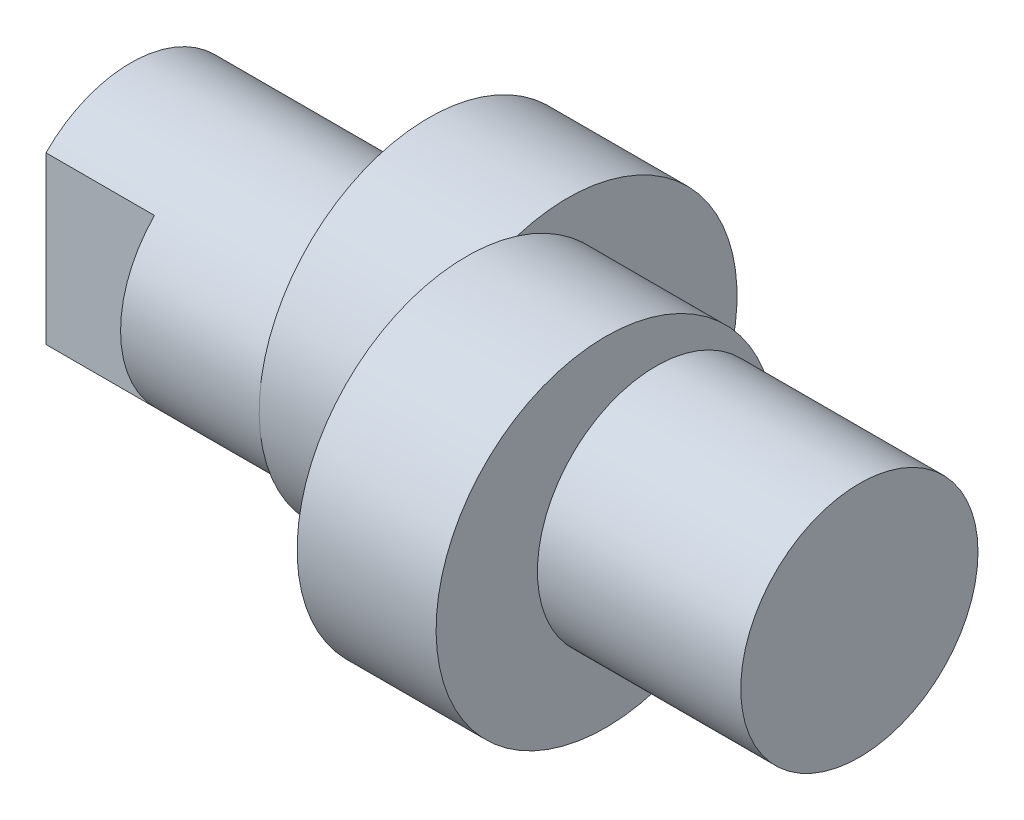
ISO-10303-21;
HEADER;
FILE_DESCRIPTION(('STEP AP214'),'2;1');
FILE_NAME('part.step','',(''),(''),'','','');
FILE_SCHEMA(('AUTOMOTIVE_DESIGN { 1 0 10303 214 1 1 1 1 }'));
ENDSEC;
DATA;
#1=APPLICATION_CONTEXT('core data for automotive mechanical design processes');
#2=APPLICATION_PROTOCOL_DEFINITION('international standard','automotive_design',2000,#1);
#3=PRODUCT_CONTEXT('',#1,'mechanical');
#4=PRODUCT('Part','Part','',(#3));
#5=PRODUCT_RELATED_PRODUCT_CATEGORY('part','',(#4));
#6=PRODUCT_DEFINITION_FORMATION('','',#4);
#7=PRODUCT_DEFINITION_CONTEXT('part definition',#1,'design');
#8=PRODUCT_DEFINITION('design','',#6,#7);
#9=PRODUCT_DEFINITION_SHAPE('','',#8);
#10=(LENGTH_UNIT() NAMED_UNIT(*) SI_UNIT(.MILLI.,.METRE.));
#11=(NAMED_UNIT(*) PLANE_ANGLE_UNIT() SI_UNIT($,.RADIAN.));
#12=(NAMED_UNIT(*) SI_UNIT($,.STERADIAN.) SOLID_ANGLE_UNIT());
#13=UNCERTAINTY_MEASURE_WITH_UNIT(LENGTH_MEASURE(1.E-05),#10,'distance_accuracy_value','');
#14=(GEOMETRIC_REPRESENTATION_CONTEXT(3) GLOBAL_UNCERTAINTY_ASSIGNED_CONTEXT((#13)) GLOBAL_UNIT_ASSIGNED_CONTEXT((#10,
#11,#12)) REPRESENTATION_CONTEXT('',''));
#15=CARTESIAN_POINT('',(0.,0.,0.));
#16=DIRECTION('',(0.,0.,1.));
#17=DIRECTION('',(1.,0.,0.));
#18=AXIS2_PLACEMENT_3D('',#15,#16,#17);
#19=CARTESIAN_POINT('',(-7.3,0.,0.));
#20=DIRECTION('',(1.,0.,0.));
#21=DIRECTION('',(0.,0.,-1.));
#22=AXIS2_PLACEMENT_3D('',#19,#20,#21);
#23=CYLINDRICAL_SURFACE('',#22,3.5);
#24=CARTESIAN_POINT('',(0.,0.,0.));
#25=DIRECTION('',(1.,0.,0.));
#26=DIRECTION('',(0.,0.,-1.));
#27=AXIS2_PLACEMENT_3D('',#24,#25,#26);
#28=CIRCLE('',#27,3.5);
#29=CARTESIAN_POINT('',(0.,0.,-3.5));
#30=VERTEX_POINT('',#29);
#31=EDGE_CURVE('E46',#30,#30,#28,.T.);
#32=ORIENTED_EDGE('',*,*,#31,.F.);
#33=EDGE_LOOP('',(#32));
#34=FACE_BOUND('',#33,.T.);
#35=CARTESIAN_POINT('',(-4.1,0.,0.));
#36=DIRECTION('',(-1.,0.,0.));
#37=DIRECTION('',(0.,0.,1.));
#38=AXIS2_PLACEMENT_3D('',#35,#36,#37);
#39=CIRCLE('',#38,3.5);
#40=CARTESIAN_POINT('',(-4.1,2.44948974278318,-2.5));
#41=VERTEX_POINT('',#40);
#42=CARTESIAN_POINT('',(-4.1,-2.44948974278318,-2.5));
#43=VERTEX_POINT('',#42);
#44=EDGE_CURVE('E102',#41,#43,#39,.T.);
#45=ORIENTED_EDGE('',*,*,#44,.F.);
#46=DIRECTION('',(-1.,0.,0.));
#47=VECTOR('',#46,1.);
#48=CARTESIAN_POINT('',(-4.1,2.44948974278318,-2.5));
#49=LINE('',#48,#47);
#50=CARTESIAN_POINT('',(-7.3,2.44948974278318,-2.5));
#51=VERTEX_POINT('',#50);
#52=EDGE_CURVE('E91',#41,#51,#49,.T.);
#53=ORIENTED_EDGE('',*,*,#52,.T.);
#54=CARTESIAN_POINT('',(-7.3,0.,0.));
#55=DIRECTION('',(1.,0.,0.));
#56=DIRECTION('',(0.,0.,-1.));
#57=AXIS2_PLACEMENT_3D('',#54,#55,#56);
#58=CIRCLE('',#57,3.5);
#59=CARTESIAN_POINT('',(-7.3,2.44948974278317,2.5));
#60=VERTEX_POINT('',#59);
#61=EDGE_CURVE('E152',#51,#60,#58,.T.);
#62=ORIENTED_EDGE('',*,*,#61,.T.);
#63=DIRECTION('',(-1.,0.,0.));
#64=VECTOR('',#63,1.);
#65=CARTESIAN_POINT('',(-4.1,2.44948974278317,2.5));
#66=LINE('',#65,#64);
#67=CARTESIAN_POINT('',(-4.1,2.44948974278317,2.5));
#68=VERTEX_POINT('',#67);
#69=EDGE_CURVE('E68',#68,#60,#66,.T.);
#70=ORIENTED_EDGE('',*,*,#69,.F.);
#71=CARTESIAN_POINT('',(-4.1,0.,0.));
#72=DIRECTION('',(-1.,0.,0.));
#73=DIRECTION('',(0.,0.,1.));
#74=AXIS2_PLACEMENT_3D('',#71,#72,#73);
#75=CIRCLE('',#74,3.5);
#76=CARTESIAN_POINT('',(-4.1,-2.44948974278317,2.5));
#77=VERTEX_POINT('',#76);
#78=EDGE_CURVE('E118',#77,#68,#75,.T.);
#79=ORIENTED_EDGE('',*,*,#78,.F.);
#80=DIRECTION('',(-1.,0.,0.));
#81=VECTOR('',#80,1.);
#82=CARTESIAN_POINT('',(-4.1,-2.44948974278317,2.5));
#83=LINE('',#82,#81);
#84=CARTESIAN_POINT('',(-7.3,-2.44948974278317,2.5));
#85=VERTEX_POINT('',#84);
#86=EDGE_CURVE('E114',#77,#85,#83,.T.);
#87=ORIENTED_EDGE('',*,*,#86,.T.);
#88=CARTESIAN_POINT('',(-7.3,-2.44948974278318,-2.5));
#89=VERTEX_POINT('',#88);
#90=EDGE_CURVE('E154',#85,#89,#58,.T.);
#91=ORIENTED_EDGE('',*,*,#90,.T.);
#92=DIRECTION('',(-1.,0.,0.));
#93=VECTOR('',#92,1.);
#94=CARTESIAN_POINT('',(-4.1,-2.44948974278318,-2.5));
#95=LINE('',#94,#93);
#96=EDGE_CURVE('E60',#43,#89,#95,.T.);
#97=ORIENTED_EDGE('',*,*,#96,.F.);
#98=EDGE_LOOP('',(#45,#53,#62,#70,#79,#87,#91,#97));
#99=FACE_BOUND('',#98,.T.);
#100=ADVANCED_FACE('F43',(#34,#99),#23,.T.);
#101=CARTESIAN_POINT('',(-7.3,0.,0.));
#102=DIRECTION('',(1.,0.,0.));
#103=DIRECTION('',(0.,0.,-1.));
#104=AXIS2_PLACEMENT_3D('',#101,#102,#103);
#105=PLANE('',#104);
#106=DIRECTION('',(0.,-1.,0.));
#107=VECTOR('',#106,1.);
#108=CARTESIAN_POINT('',(-7.3,0.,-2.5));
#109=LINE('',#108,#107);
#110=EDGE_CURVE('E96',#51,#89,#109,.T.);
#111=ORIENTED_EDGE('',*,*,#110,.T.);
#112=ORIENTED_EDGE('',*,*,#90,.F.);
#113=DIRECTION('',(0.,-1.,0.));
#114=VECTOR('',#113,1.);
#115=CARTESIAN_POINT('',(-7.3,0.,2.5));
#116=LINE('',#115,#114);
#117=EDGE_CURVE('E122',#60,#85,#116,.T.);
#118=ORIENTED_EDGE('',*,*,#117,.F.);
#119=ORIENTED_EDGE('',*,*,#61,.F.);
#120=EDGE_LOOP('',(#111,#112,#118,#119));
#121=FACE_BOUND('',#120,.T.);
#122=ADVANCED_FACE('F167',(#121),#105,.F.);
#123=CARTESIAN_POINT('',(4.1,0.,-1.49));
#124=DIRECTION('',(-1.,0.,0.));
#125=DIRECTION('',(0.,0.,1.));
#126=AXIS2_PLACEMENT_3D('',#123,#124,#125);
#127=CYLINDRICAL_SURFACE('',#126,5.);
#128=CARTESIAN_POINT('',(4.1,0.,-1.49));
#129=DIRECTION('',(1.,0.,0.));
#130=DIRECTION('',(0.,0.,-1.));
#131=AXIS2_PLACEMENT_3D('',#128,#129,#130);
#132=CIRCLE('',#131,5.);
#133=CARTESIAN_POINT('',(4.1,4.77282934955777,0.));
#134=VERTEX_POINT('',#133);
#135=CARTESIAN_POINT('',(4.1,-4.77282934955777,0.));
#136=VERTEX_POINT('',#135);
#137=EDGE_CURVE('E145',#134,#136,#132,.T.);
#138=ORIENTED_EDGE('',*,*,#137,.F.);
#139=EDGE_CURVE('E149',#136,#134,#132,.T.);
#140=ORIENTED_EDGE('',*,*,#139,.F.);
#141=EDGE_LOOP('',(#138,#140));
#142=FACE_BOUND('',#141,.T.);
#143=CARTESIAN_POINT('',(0.,0.,-1.49));
#144=DIRECTION('',(1.,0.,0.));
#145=DIRECTION('',(0.,0.,-1.));
#146=AXIS2_PLACEMENT_3D('',#143,#144,#145);
#147=CIRCLE('',#146,5.);
#148=CARTESIAN_POINT('',(0.,0.,-6.49));
#149=VERTEX_POINT('',#148);
#150=EDGE_CURVE('E141',#149,#149,#147,.T.);
#151=ORIENTED_EDGE('',*,*,#150,.T.);
#152=EDGE_LOOP('',(#151));
#153=FACE_BOUND('',#152,.T.);
#154=ADVANCED_FACE('F171',(#142,#153),#127,.T.);
#155=CARTESIAN_POINT('',(4.1,0.,-1.49));
#156=DIRECTION('',(1.,0.,0.));
#157=DIRECTION('',(0.,0.,-1.));
#158=AXIS2_PLACEMENT_3D('',#155,#156,#157);
#159=PLANE('',#158);
#160=CARTESIAN_POINT('',(4.1,0.,1.49));
#161=DIRECTION('',(1.,0.,0.));
#162=DIRECTION('',(0.,0.,-1.));
#163=AXIS2_PLACEMENT_3D('',#160,#161,#162);
#164=CIRCLE('',#163,5.);
#165=EDGE_CURVE('E52',#136,#134,#164,.T.);
#166=ORIENTED_EDGE('',*,*,#165,.F.);
#167=ORIENTED_EDGE('',*,*,#139,.T.);
#168=EDGE_LOOP('',(#166,#167));
#169=FACE_BOUND('',#168,.T.);
#170=ADVANCED_FACE('F176',(#169),#159,.T.);
#171=CARTESIAN_POINT('',(0.,0.,-1.49));
#172=DIRECTION('',(1.,0.,0.));
#173=DIRECTION('',(0.,0.,-1.));
#174=AXIS2_PLACEMENT_3D('',#171,#172,#173);
#175=PLANE('',#174);
#176=ORIENTED_EDGE('',*,*,#31,.T.);
#177=EDGE_LOOP('',(#176));
#178=FACE_BOUND('',#177,.T.);
#179=ORIENTED_EDGE('',*,*,#150,.F.);
#180=EDGE_LOOP('',(#179));
#181=FACE_BOUND('',#180,.T.);
#182=ADVANCED_FACE('F163',(#178,#181),#175,.F.);
#183=CARTESIAN_POINT('',(4.1,0.,1.49));
#184=DIRECTION('',(1.,0.,0.));
#185=DIRECTION('',(0.,0.,-1.));
#186=AXIS2_PLACEMENT_3D('',#183,#184,#185);
#187=PLANE('',#186);
#188=EDGE_CURVE('E135',#134,#136,#164,.T.);
#189=ORIENTED_EDGE('',*,*,#188,.F.);
#190=ORIENTED_EDGE('',*,*,#137,.T.);
#191=EDGE_LOOP('',(#189,#190));
#192=FACE_BOUND('',#191,.T.);
#193=ADVANCED_FACE('F182',(#192),#187,.F.);
#194=CARTESIAN_POINT('',(8.2,0.,1.49));
#195=DIRECTION('',(-1.,0.,0.));
#196=DIRECTION('',(0.,0.,1.));
#197=AXIS2_PLACEMENT_3D('',#194,#195,#196);
#198=CYLINDRICAL_SURFACE('',#197,5.);
#199=CARTESIAN_POINT('',(8.2,0.,1.49));
#200=DIRECTION('',(1.,0.,0.));
#201=DIRECTION('',(0.,0.,-1.));
#202=AXIS2_PLACEMENT_3D('',#199,#200,#201);
#203=CIRCLE('',#202,5.);
#204=CARTESIAN_POINT('',(8.2,0.,-3.51));
#205=VERTEX_POINT('',#204);
#206=EDGE_CURVE('E137',#205,#205,#203,.T.);
#207=ORIENTED_EDGE('',*,*,#206,.F.);
#208=EDGE_LOOP('',(#207));
#209=FACE_BOUND('',#208,.T.);
#210=ORIENTED_EDGE('',*,*,#188,.T.);
#211=ORIENTED_EDGE('',*,*,#165,.T.);
#212=EDGE_LOOP('',(#210,#211));
#213=FACE_BOUND('',#212,.T.);
#214=ADVANCED_FACE('F186',(#209,#213),#198,.T.);
#215=CARTESIAN_POINT('',(8.2,0.,1.49));
#216=DIRECTION('',(1.,0.,0.));
#217=DIRECTION('',(0.,0.,-1.));
#218=AXIS2_PLACEMENT_3D('',#215,#216,#217);
#219=PLANE('',#218);
#220=CARTESIAN_POINT('',(8.2,0.,0.));
#221=DIRECTION('',(1.,0.,0.));
#222=DIRECTION('',(0.,0.,-1.));
#223=AXIS2_PLACEMENT_3D('',#220,#221,#222);
#224=CIRCLE('',#223,3.5);
#225=CARTESIAN_POINT('',(8.2,0.,-3.5));
#226=VERTEX_POINT('',#225);
#227=EDGE_CURVE('E11',#226,#226,#224,.T.);
#228=ORIENTED_EDGE('',*,*,#227,.F.);
#229=EDGE_LOOP('',(#228));
#230=FACE_BOUND('',#229,.T.);
#231=ORIENTED_EDGE('',*,*,#206,.T.);
#232=EDGE_LOOP('',(#231));
#233=FACE_BOUND('',#232,.T.);
#234=ADVANCED_FACE('F189',(#230,#233),#219,.T.);
#235=CARTESIAN_POINT('',(14.2,0.,0.));
#236=DIRECTION('',(-1.,0.,0.));
#237=DIRECTION('',(0.,0.,1.));
#238=AXIS2_PLACEMENT_3D('',#235,#236,#237);
#239=CYLINDRICAL_SURFACE('',#238,3.5);
#240=CARTESIAN_POINT('',(14.2,0.,0.));
#241=DIRECTION('',(1.,0.,0.));
#242=DIRECTION('',(0.,0.,-1.));
#243=AXIS2_PLACEMENT_3D('',#240,#241,#242);
#244=CIRCLE('',#243,3.5);
#245=CARTESIAN_POINT('',(14.2,0.,-3.5));
#246=VERTEX_POINT('',#245);
#247=EDGE_CURVE('E116',#246,#246,#244,.T.);
#248=ORIENTED_EDGE('',*,*,#247,.F.);
#249=EDGE_LOOP('',(#248));
#250=FACE_BOUND('',#249,.T.);
#251=ORIENTED_EDGE('',*,*,#227,.T.);
#252=EDGE_LOOP('',(#251));
#253=FACE_BOUND('',#252,.T.);
#254=ADVANCED_FACE('F196',(#250,#253),#239,.T.);
#255=CARTESIAN_POINT('',(14.2,0.,0.));
#256=DIRECTION('',(1.,0.,0.));
#257=DIRECTION('',(0.,0.,-1.));
#258=AXIS2_PLACEMENT_3D('',#255,#256,#257);
#259=PLANE('',#258);
#260=ORIENTED_EDGE('',*,*,#247,.T.);
#261=EDGE_LOOP('',(#260));
#262=FACE_BOUND('',#261,.T.);
#263=ADVANCED_FACE('F200',(#262),#259,.T.);
#264=CARTESIAN_POINT('',(-4.1,0.,2.5));
#265=DIRECTION('',(0.,0.,-1.));
#266=DIRECTION('',(-1.,0.,0.));
#267=AXIS2_PLACEMENT_3D('',#264,#265,#266);
#268=PLANE('',#267);
#269=ORIENTED_EDGE('',*,*,#117,.T.);
#270=ORIENTED_EDGE('',*,*,#86,.F.);
#271=DIRECTION('',(0.,-1.,0.));
#272=VECTOR('',#271,1.);
#273=CARTESIAN_POINT('',(-4.1,0.,2.5));
#274=LINE('',#273,#272);
#275=EDGE_CURVE('E121',#68,#77,#274,.T.);
#276=ORIENTED_EDGE('',*,*,#275,.F.);
#277=ORIENTED_EDGE('',*,*,#69,.T.);
#278=EDGE_LOOP('',(#269,#270,#276,#277));
#279=FACE_BOUND('',#278,.T.);
#280=ADVANCED_FACE('F204',(#279),#268,.F.);
#281=CARTESIAN_POINT('',(-4.1,0.,0.));
#282=DIRECTION('',(-1.,0.,0.));
#283=DIRECTION('',(0.,0.,1.));
#284=AXIS2_PLACEMENT_3D('',#281,#282,#283);
#285=PLANE('',#284);
#286=ORIENTED_EDGE('',*,*,#78,.T.);
#287=ORIENTED_EDGE('',*,*,#275,.T.);
#288=EDGE_LOOP('',(#286,#287));
#289=FACE_BOUND('',#288,.T.);
#290=ADVANCED_FACE('F208',(#289),#285,.T.);
#291=CARTESIAN_POINT('',(-4.1,0.,-2.5));
#292=DIRECTION('',(0.,0.,-1.));
#293=DIRECTION('',(-1.,0.,0.));
#294=AXIS2_PLACEMENT_3D('',#291,#292,#293);
#295=PLANE('',#294);
#296=ORIENTED_EDGE('',*,*,#110,.F.);
#297=ORIENTED_EDGE('',*,*,#52,.F.);
#298=DIRECTION('',(0.,-1.,0.));
#299=VECTOR('',#298,1.);
#300=CARTESIAN_POINT('',(-4.1,0.,-2.5));
#301=LINE('',#300,#299);
#302=EDGE_CURVE('E94',#41,#43,#301,.T.);
#303=ORIENTED_EDGE('',*,*,#302,.T.);
#304=ORIENTED_EDGE('',*,*,#96,.T.);
#305=EDGE_LOOP('',(#296,#297,#303,#304));
#306=FACE_BOUND('',#305,.T.);
#307=ADVANCED_FACE('F93',(#306),#295,.T.);
#308=CARTESIAN_POINT('',(-4.1,0.,0.));
#309=DIRECTION('',(-1.,0.,0.));
#310=DIRECTION('',(0.,0.,1.));
#311=AXIS2_PLACEMENT_3D('',#308,#309,#310);
#312=PLANE('',#311);
#313=ORIENTED_EDGE('',*,*,#302,.F.);
#314=ORIENTED_EDGE('',*,*,#44,.T.);
#315=EDGE_LOOP('',(#313,#314));
#316=FACE_BOUND('',#315,.T.);
#317=ADVANCED_FACE('F105',(#316),#312,.T.);
#318=CLOSED_SHELL('',(#100,#122,#154,#170,#182,#193,#214,#234,#254,#263,#280,#290,#307,#317));
#319=MANIFOLD_SOLID_BREP('B2',#318);
#320=ADVANCED_BREP_SHAPE_REPRESENTATION('',(#18,#319),#14);
#321=SHAPE_DEFINITION_REPRESENTATION(#9,#320);
ENDSEC;
END-ISO-10303-21;
